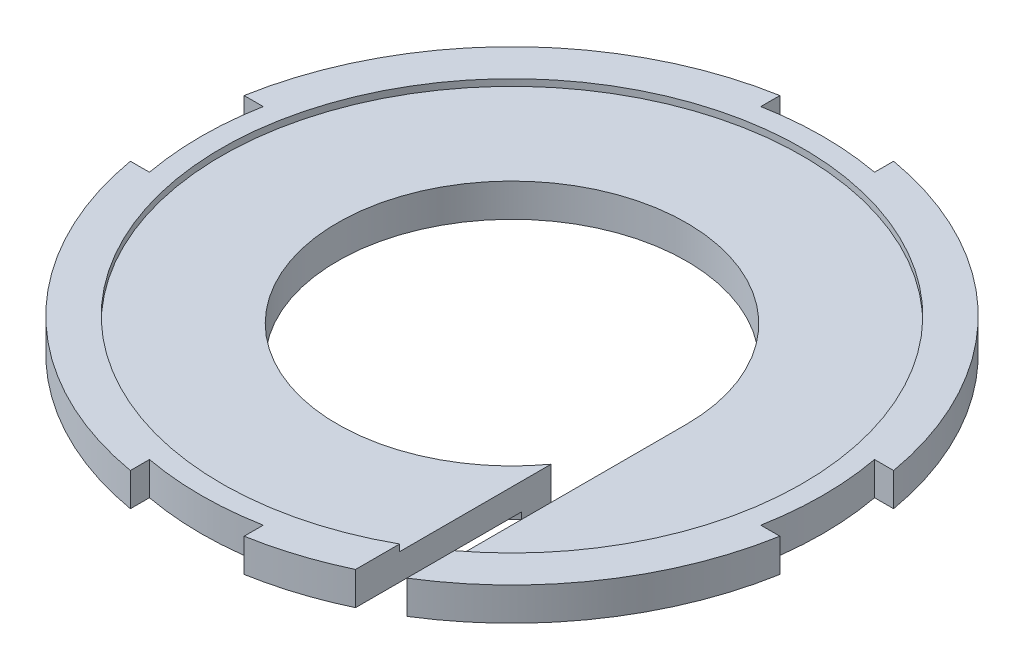
ISO-10303-21;
HEADER;
FILE_DESCRIPTION(('STEP AP214'),'2;1');
FILE_NAME('part.step','',(''),(''),'','','');
FILE_SCHEMA(('AUTOMOTIVE_DESIGN { 1 0 10303 214 1 1 1 1 }'));
ENDSEC;
DATA;
#1=APPLICATION_CONTEXT('core data for automotive mechanical design processes');
#2=APPLICATION_PROTOCOL_DEFINITION('international standard','automotive_design',2000,#1);
#3=PRODUCT_CONTEXT('',#1,'mechanical');
#4=PRODUCT('Part','Part','',(#3));
#5=PRODUCT_RELATED_PRODUCT_CATEGORY('part','',(#4));
#6=PRODUCT_DEFINITION_FORMATION('','',#4);
#7=PRODUCT_DEFINITION_CONTEXT('part definition',#1,'design');
#8=PRODUCT_DEFINITION('design','',#6,#7);
#9=PRODUCT_DEFINITION_SHAPE('','',#8);
#10=(LENGTH_UNIT() NAMED_UNIT(*) SI_UNIT(.MILLI.,.METRE.));
#11=(NAMED_UNIT(*) PLANE_ANGLE_UNIT() SI_UNIT($,.RADIAN.));
#12=(NAMED_UNIT(*) SI_UNIT($,.STERADIAN.) SOLID_ANGLE_UNIT());
#13=UNCERTAINTY_MEASURE_WITH_UNIT(LENGTH_MEASURE(1.E-05),#10,'distance_accuracy_value','');
#14=(GEOMETRIC_REPRESENTATION_CONTEXT(3) GLOBAL_UNCERTAINTY_ASSIGNED_CONTEXT((#13)) GLOBAL_UNIT_ASSIGNED_CONTEXT((#10,
#11,#12)) REPRESENTATION_CONTEXT('',''));
#15=CARTESIAN_POINT('',(0.,0.,0.));
#16=DIRECTION('',(0.,0.,1.));
#17=DIRECTION('',(1.,0.,0.));
#18=AXIS2_PLACEMENT_3D('',#15,#16,#17);
#19=CARTESIAN_POINT('',(20.066,0.,0.));
#20=DIRECTION('',(1.,0.,0.));
#21=DIRECTION('',(0.,0.,-1.));
#22=AXIS2_PLACEMENT_3D('',#19,#20,#21);
#23=PLANE('',#22);
#24=DIRECTION('',(0.,1.,0.));
#25=VECTOR('',#24,1.);
#26=CARTESIAN_POINT('',(20.0660000000001,3.048,26.7017311236556));
#27=LINE('',#26,#25);
#28=CARTESIAN_POINT('',(20.0660000000001,3.048,26.7017311236556));
#29=VERTEX_POINT('',#28);
#30=CARTESIAN_POINT('',(20.0660000000001,3.81,26.7017311236556));
#31=VERTEX_POINT('',#30);
#32=EDGE_CURVE('E237',#29,#31,#27,.T.);
#33=ORIENTED_EDGE('',*,*,#32,.F.);
#34=DIRECTION('',(0.,0.,-1.));
#35=VECTOR('',#34,1.);
#36=CARTESIAN_POINT('',(20.066,3.048,0.));
#37=LINE('',#36,#35);
#38=CARTESIAN_POINT('',(20.066,3.048,0.));
#39=VERTEX_POINT('',#38);
#40=EDGE_CURVE('E234',#29,#39,#37,.T.);
#41=ORIENTED_EDGE('',*,*,#40,.T.);
#42=DIRECTION('',(0.,1.,0.));
#43=VECTOR('',#42,1.);
#44=CARTESIAN_POINT('',(20.066,0.,0.));
#45=LINE('',#44,#43);
#46=CARTESIAN_POINT('',(20.066,-0.762,0.));
#47=VERTEX_POINT('',#46);
#48=EDGE_CURVE('E202',#47,#39,#45,.T.);
#49=ORIENTED_EDGE('',*,*,#48,.F.);
#50=DIRECTION('',(0.,0.,-1.));
#51=VECTOR('',#50,1.);
#52=CARTESIAN_POINT('',(20.066,-0.762,0.));
#53=LINE('',#52,#51);
#54=CARTESIAN_POINT('',(20.066,-0.762,9.55543138743609));
#55=VERTEX_POINT('',#54);
#56=EDGE_CURVE('E217',#55,#47,#53,.T.);
#57=ORIENTED_EDGE('',*,*,#56,.F.);
#58=DIRECTION('',(0.,1.,0.));
#59=VECTOR('',#58,1.);
#60=CARTESIAN_POINT('',(20.066,-0.762,9.55543138743609));
#61=LINE('',#60,#59);
#62=CARTESIAN_POINT('',(20.066,0.,9.55543138743609));
#63=VERTEX_POINT('',#62);
#64=EDGE_CURVE('E222',#55,#63,#61,.T.);
#65=ORIENTED_EDGE('',*,*,#64,.T.);
#66=DIRECTION('',(0.,0.,-1.));
#67=VECTOR('',#66,1.);
#68=CARTESIAN_POINT('',(20.066,0.,0.));
#69=LINE('',#68,#67);
#70=CARTESIAN_POINT('',(20.0660000000001,0.,32.1634238576989));
#71=VERTEX_POINT('',#70);
#72=EDGE_CURVE('E240',#71,#63,#69,.T.);
#73=ORIENTED_EDGE('',*,*,#72,.F.);
#74=DIRECTION('',(0.,1.,0.));
#75=VECTOR('',#74,1.);
#76=CARTESIAN_POINT('',(20.0660000000001,1.17154113246704E-13,32.1634238576989));
#77=LINE('',#76,#75);
#78=CARTESIAN_POINT('',(20.0660000000001,3.81,32.1634238576989));
#79=VERTEX_POINT('',#78);
#80=EDGE_CURVE('E251',#71,#79,#77,.T.);
#81=ORIENTED_EDGE('',*,*,#80,.T.);
#82=DIRECTION('',(0.,0.,-1.));
#83=VECTOR('',#82,1.);
#84=CARTESIAN_POINT('',(20.066,3.81,0.));
#85=LINE('',#84,#83);
#86=EDGE_CURVE('E239',#79,#31,#85,.T.);
#87=ORIENTED_EDGE('',*,*,#86,.T.);
#88=EDGE_LOOP('',(#33,#41,#49,#57,#65,#73,#81,#87));
#89=FACE_BOUND('',#88,.T.);
#90=ADVANCED_FACE('F33',(#89),#23,.F.);
#91=CARTESIAN_POINT('',(16.256,0.,0.));
#92=DIRECTION('',(-1.,0.,0.));
#93=DIRECTION('',(0.,0.,1.));
#94=AXIS2_PLACEMENT_3D('',#91,#92,#93);
#95=PLANE('',#94);
#96=DIRECTION('',(0.,1.,0.));
#97=VECTOR('',#96,1.);
#98=CARTESIAN_POINT('',(16.2560000000001,3.048,29.1782327257837));
#99=LINE('',#98,#97);
#100=CARTESIAN_POINT('',(16.2560000000001,3.81,29.1782327257837));
#101=VERTEX_POINT('',#100);
#102=CARTESIAN_POINT('',(16.2560000000001,3.048,29.1782327257837));
#103=VERTEX_POINT('',#102);
#104=EDGE_CURVE('E11',#101,#103,#99,.F.);
#105=ORIENTED_EDGE('',*,*,#104,.F.);
#106=DIRECTION('',(0.,0.,1.));
#107=VECTOR('',#106,1.);
#108=CARTESIAN_POINT('',(16.256,3.81,0.));
#109=LINE('',#108,#107);
#110=CARTESIAN_POINT('',(16.2560000000001,3.81,34.2472284170558));
#111=VERTEX_POINT('',#110);
#112=EDGE_CURVE('E243',#101,#111,#109,.T.);
#113=ORIENTED_EDGE('',*,*,#112,.T.);
#114=DIRECTION('',(0.,1.,0.));
#115=VECTOR('',#114,1.);
#116=CARTESIAN_POINT('',(16.2560000000001,1.24744296319595E-13,34.2472284170558));
#117=LINE('',#116,#115);
#118=CARTESIAN_POINT('',(16.2560000000001,0.,34.2472284170558));
#119=VERTEX_POINT('',#118);
#120=EDGE_CURVE('E201',#111,#119,#117,.F.);
#121=ORIENTED_EDGE('',*,*,#120,.T.);
#122=DIRECTION('',(0.,0.,1.));
#123=VECTOR('',#122,1.);
#124=CARTESIAN_POINT('',(16.256,0.,0.));
#125=LINE('',#124,#123);
#126=CARTESIAN_POINT('',(16.2560000000001,0.,15.1556289542862));
#127=VERTEX_POINT('',#126);
#128=EDGE_CURVE('E242',#127,#119,#125,.T.);
#129=ORIENTED_EDGE('',*,*,#128,.F.);
#130=DIRECTION('',(0.,1.,0.));
#131=VECTOR('',#130,1.);
#132=CARTESIAN_POINT('',(16.256,-0.762,15.1556289542862));
#133=LINE('',#132,#131);
#134=CARTESIAN_POINT('',(16.256,-0.762,15.1556289542862));
#135=VERTEX_POINT('',#134);
#136=EDGE_CURVE('E209',#135,#127,#133,.T.);
#137=ORIENTED_EDGE('',*,*,#136,.F.);
#138=DIRECTION('',(0.,0.,1.));
#139=VECTOR('',#138,1.);
#140=CARTESIAN_POINT('',(16.256,-0.762,11.7637927557399));
#141=LINE('',#140,#139);
#142=CARTESIAN_POINT('',(16.256,-0.762,11.7637927557399));
#143=VERTEX_POINT('',#142);
#144=EDGE_CURVE('E205',#143,#135,#141,.T.);
#145=ORIENTED_EDGE('',*,*,#144,.F.);
#146=DIRECTION('',(0.,1.,0.));
#147=VECTOR('',#146,1.);
#148=CARTESIAN_POINT('',(16.256,0.,11.7637927557399));
#149=LINE('',#148,#147);
#150=CARTESIAN_POINT('',(16.256,3.048,11.7637927557399));
#151=VERTEX_POINT('',#150);
#152=EDGE_CURVE('E194',#143,#151,#149,.T.);
#153=ORIENTED_EDGE('',*,*,#152,.T.);
#154=DIRECTION('',(0.,0.,1.));
#155=VECTOR('',#154,1.);
#156=CARTESIAN_POINT('',(16.256,3.048,0.));
#157=LINE('',#156,#155);
#158=EDGE_CURVE('E56',#151,#103,#157,.T.);
#159=ORIENTED_EDGE('',*,*,#158,.T.);
#160=EDGE_LOOP('',(#105,#113,#121,#129,#137,#145,#153,#159));
#161=FACE_BOUND('',#160,.T.);
#162=ADVANCED_FACE('F207',(#161),#95,.F.);
#163=CARTESIAN_POINT('',(0.,0.,0.));
#164=DIRECTION('',(0.,1.,0.));
#165=DIRECTION('',(0.,0.,1.));
#166=AXIS2_PLACEMENT_3D('',#163,#164,#165);
#167=CYLINDRICAL_SURFACE('',#166,37.9095);
#168=ORIENTED_EDGE('',*,*,#80,.F.);
#169=CARTESIAN_POINT('',(0.,0.,0.));
#170=DIRECTION('',(0.,1.,0.));
#171=DIRECTION('',(0.,0.,1.));
#172=AXIS2_PLACEMENT_3D('',#169,#170,#171);
#173=CIRCLE('',#172,37.9095);
#174=CARTESIAN_POINT('',(37.3410236870925,0.,6.5405));
#175=VERTEX_POINT('',#174);
#176=EDGE_CURVE('E328',#71,#175,#173,.T.);
#177=ORIENTED_EDGE('',*,*,#176,.T.);
#178=DIRECTION('',(0.,1.,0.));
#179=VECTOR('',#178,1.);
#180=CARTESIAN_POINT('',(37.3410236870925,0.,6.5405));
#181=LINE('',#180,#179);
#182=CARTESIAN_POINT('',(37.3410236870925,3.81,6.54049999999998));
#183=VERTEX_POINT('',#182);
#184=EDGE_CURVE('E333',#175,#183,#181,.T.);
#185=ORIENTED_EDGE('',*,*,#184,.T.);
#186=CARTESIAN_POINT('',(0.,3.81,0.));
#187=DIRECTION('',(0.,1.,0.));
#188=DIRECTION('',(0.,0.,1.));
#189=AXIS2_PLACEMENT_3D('',#186,#187,#188);
#190=CIRCLE('',#189,37.9095);
#191=EDGE_CURVE('E288',#79,#183,#190,.T.);
#192=ORIENTED_EDGE('',*,*,#191,.F.);
#193=EDGE_LOOP('',(#168,#177,#185,#192));
#194=FACE_BOUND('',#193,.T.);
#195=ADVANCED_FACE('F387',(#194),#167,.T.);
#196=CARTESIAN_POINT('',(0.,0.,0.));
#197=DIRECTION('',(0.,1.,0.));
#198=DIRECTION('',(0.,0.,1.));
#199=AXIS2_PLACEMENT_3D('',#196,#197,#198);
#200=CYLINDRICAL_SURFACE('',#199,35.7505);
#201=DIRECTION('',(0.,1.,0.));
#202=VECTOR('',#201,1.);
#203=CARTESIAN_POINT('',(35.1471209347224,0.,-6.5405));
#204=LINE('',#203,#202);
#205=CARTESIAN_POINT('',(35.1471209347224,0.,-6.5405));
#206=VERTEX_POINT('',#205);
#207=CARTESIAN_POINT('',(35.1471209347224,3.81,-6.54050000000001));
#208=VERTEX_POINT('',#207);
#209=EDGE_CURVE('E338',#206,#208,#204,.T.);
#210=ORIENTED_EDGE('',*,*,#209,.T.);
#211=CARTESIAN_POINT('',(0.,3.81,0.));
#212=DIRECTION('',(0.,1.,0.));
#213=DIRECTION('',(0.,0.,1.));
#214=AXIS2_PLACEMENT_3D('',#211,#212,#213);
#215=CIRCLE('',#214,35.7505);
#216=CARTESIAN_POINT('',(35.1471209347224,3.81,6.54049999999999));
#217=VERTEX_POINT('',#216);
#218=EDGE_CURVE('E258',#217,#208,#215,.T.);
#219=ORIENTED_EDGE('',*,*,#218,.F.);
#220=DIRECTION('',(0.,1.,0.));
#221=VECTOR('',#220,1.);
#222=CARTESIAN_POINT('',(35.1471209347224,0.,6.5405));
#223=LINE('',#222,#221);
#224=CARTESIAN_POINT('',(35.1471209347224,0.,6.5405));
#225=VERTEX_POINT('',#224);
#226=EDGE_CURVE('E253',#225,#217,#223,.T.);
#227=ORIENTED_EDGE('',*,*,#226,.F.);
#228=CARTESIAN_POINT('',(0.,0.,0.));
#229=DIRECTION('',(0.,1.,0.));
#230=DIRECTION('',(0.,0.,1.));
#231=AXIS2_PLACEMENT_3D('',#228,#229,#230);
#232=CIRCLE('',#231,35.7505);
#233=EDGE_CURVE('E307',#225,#206,#232,.T.);
#234=ORIENTED_EDGE('',*,*,#233,.T.);
#235=EDGE_LOOP('',(#210,#219,#227,#234));
#236=FACE_BOUND('',#235,.T.);
#237=ADVANCED_FACE('F399',(#236),#200,.T.);
#238=CARTESIAN_POINT('',(35.1471209347224,0.,-6.5405));
#239=DIRECTION('',(0.,0.,1.));
#240=DIRECTION('',(0.,-1.,0.));
#241=AXIS2_PLACEMENT_3D('',#238,#239,#240);
#242=PLANE('',#241);
#243=DIRECTION('',(0.,1.,0.));
#244=VECTOR('',#243,1.);
#245=CARTESIAN_POINT('',(37.3410236870925,0.,-6.5405));
#246=LINE('',#245,#244);
#247=CARTESIAN_POINT('',(37.3410236870925,0.,-6.5405));
#248=VERTEX_POINT('',#247);
#249=CARTESIAN_POINT('',(37.3410236870925,3.81,-6.54050000000001));
#250=VERTEX_POINT('',#249);
#251=EDGE_CURVE('E341',#248,#250,#246,.T.);
#252=ORIENTED_EDGE('',*,*,#251,.T.);
#253=DIRECTION('',(1.,0.,0.));
#254=VECTOR('',#253,1.);
#255=CARTESIAN_POINT('',(35.1471209347224,3.81,-6.54050000000001));
#256=LINE('',#255,#254);
#257=EDGE_CURVE('E254',#208,#250,#256,.T.);
#258=ORIENTED_EDGE('',*,*,#257,.F.);
#259=ORIENTED_EDGE('',*,*,#209,.F.);
#260=DIRECTION('',(1.,0.,0.));
#261=VECTOR('',#260,1.);
#262=CARTESIAN_POINT('',(35.1471209347224,0.,-6.5405));
#263=LINE('',#262,#261);
#264=EDGE_CURVE('E304',#206,#248,#263,.T.);
#265=ORIENTED_EDGE('',*,*,#264,.T.);
#266=EDGE_LOOP('',(#252,#258,#259,#265));
#267=FACE_BOUND('',#266,.T.);
#268=ADVANCED_FACE('F401',(#267),#242,.T.);
#269=CARTESIAN_POINT('',(0.,0.,0.));
#270=DIRECTION('',(0.,1.,0.));
#271=DIRECTION('',(0.,0.,1.));
#272=AXIS2_PLACEMENT_3D('',#269,#270,#271);
#273=CYLINDRICAL_SURFACE('',#272,37.9095);
#274=DIRECTION('',(0.,1.,0.));
#275=VECTOR('',#274,1.);
#276=CARTESIAN_POINT('',(6.5405,0.,-37.3410236870925));
#277=LINE('',#276,#275);
#278=CARTESIAN_POINT('',(6.5405,0.,-37.3410236870925));
#279=VERTEX_POINT('',#278);
#280=CARTESIAN_POINT('',(6.5405,3.81,-37.3410236870925));
#281=VERTEX_POINT('',#280);
#282=EDGE_CURVE('E346',#279,#281,#277,.T.);
#283=ORIENTED_EDGE('',*,*,#282,.T.);
#284=CARTESIAN_POINT('',(0.,3.81,0.));
#285=DIRECTION('',(0.,1.,0.));
#286=DIRECTION('',(0.,0.,1.));
#287=AXIS2_PLACEMENT_3D('',#284,#285,#286);
#288=CIRCLE('',#287,37.9095);
#289=EDGE_CURVE('E257',#250,#281,#288,.T.);
#290=ORIENTED_EDGE('',*,*,#289,.F.);
#291=ORIENTED_EDGE('',*,*,#251,.F.);
#292=CARTESIAN_POINT('',(0.,0.,0.));
#293=DIRECTION('',(0.,1.,0.));
#294=DIRECTION('',(0.,0.,1.));
#295=AXIS2_PLACEMENT_3D('',#292,#293,#294);
#296=CIRCLE('',#295,37.9095);
#297=EDGE_CURVE('E306',#248,#279,#296,.T.);
#298=ORIENTED_EDGE('',*,*,#297,.T.);
#299=EDGE_LOOP('',(#283,#290,#291,#298));
#300=FACE_BOUND('',#299,.T.);
#301=ADVANCED_FACE('F465',(#300),#273,.T.);
#302=CARTESIAN_POINT('',(6.54049999999999,0.,-35.1471209347224));
#303=DIRECTION('',(-1.,0.,0.));
#304=DIRECTION('',(0.,0.,1.));
#305=AXIS2_PLACEMENT_3D('',#302,#303,#304);
#306=PLANE('',#305);
#307=DIRECTION('',(0.,1.,0.));
#308=VECTOR('',#307,1.);
#309=CARTESIAN_POINT('',(6.54049999999999,0.,-35.1471209347224));
#310=LINE('',#309,#308);
#311=CARTESIAN_POINT('',(6.54049999999999,0.,-35.1471209347224));
#312=VERTEX_POINT('',#311);
#313=CARTESIAN_POINT('',(6.54049999999999,3.81,-35.1471209347224));
#314=VERTEX_POINT('',#313);
#315=EDGE_CURVE('E349',#312,#314,#310,.T.);
#316=ORIENTED_EDGE('',*,*,#315,.T.);
#317=DIRECTION('',(0.,0.,1.));
#318=VECTOR('',#317,1.);
#319=CARTESIAN_POINT('',(6.54049999999999,3.81,-35.1471209347224));
#320=LINE('',#319,#318);
#321=EDGE_CURVE('E261',#281,#314,#320,.T.);
#322=ORIENTED_EDGE('',*,*,#321,.F.);
#323=ORIENTED_EDGE('',*,*,#282,.F.);
#324=DIRECTION('',(0.,0.,1.));
#325=VECTOR('',#324,1.);
#326=CARTESIAN_POINT('',(6.54049999999999,0.,-35.1471209347224));
#327=LINE('',#326,#325);
#328=EDGE_CURVE('E309',#279,#312,#327,.T.);
#329=ORIENTED_EDGE('',*,*,#328,.T.);
#330=EDGE_LOOP('',(#316,#322,#323,#329));
#331=FACE_BOUND('',#330,.T.);
#332=ADVANCED_FACE('F462',(#331),#306,.T.);
#333=CARTESIAN_POINT('',(0.,0.,0.));
#334=DIRECTION('',(0.,1.,0.));
#335=DIRECTION('',(0.,0.,1.));
#336=AXIS2_PLACEMENT_3D('',#333,#334,#335);
#337=CYLINDRICAL_SURFACE('',#336,35.7505);
#338=DIRECTION('',(0.,1.,0.));
#339=VECTOR('',#338,1.);
#340=CARTESIAN_POINT('',(-6.5405,0.,-35.1471209347224));
#341=LINE('',#340,#339);
#342=CARTESIAN_POINT('',(-6.5405,0.,-35.1471209347224));
#343=VERTEX_POINT('',#342);
#344=CARTESIAN_POINT('',(-6.5405,3.81,-35.1471209347224));
#345=VERTEX_POINT('',#344);
#346=EDGE_CURVE('E352',#343,#345,#341,.T.);
#347=ORIENTED_EDGE('',*,*,#346,.T.);
#348=CARTESIAN_POINT('',(0.,3.81,0.));
#349=DIRECTION('',(0.,1.,0.));
#350=DIRECTION('',(0.,0.,1.));
#351=AXIS2_PLACEMENT_3D('',#348,#349,#350);
#352=CIRCLE('',#351,35.7505);
#353=EDGE_CURVE('E262',#314,#345,#352,.T.);
#354=ORIENTED_EDGE('',*,*,#353,.F.);
#355=ORIENTED_EDGE('',*,*,#315,.F.);
#356=CARTESIAN_POINT('',(0.,0.,0.));
#357=DIRECTION('',(0.,1.,0.));
#358=DIRECTION('',(0.,0.,1.));
#359=AXIS2_PLACEMENT_3D('',#356,#357,#358);
#360=CIRCLE('',#359,35.7505);
#361=EDGE_CURVE('E310',#312,#343,#360,.T.);
#362=ORIENTED_EDGE('',*,*,#361,.T.);
#363=EDGE_LOOP('',(#347,#354,#355,#362));
#364=FACE_BOUND('',#363,.T.);
#365=ADVANCED_FACE('F460',(#364),#337,.T.);
#366=CARTESIAN_POINT('',(-6.54050000000001,0.,-35.1471209347224));
#367=DIRECTION('',(1.,0.,0.));
#368=DIRECTION('',(0.,0.,-1.));
#369=AXIS2_PLACEMENT_3D('',#366,#367,#368);
#370=PLANE('',#369);
#371=DIRECTION('',(0.,1.,0.));
#372=VECTOR('',#371,1.);
#373=CARTESIAN_POINT('',(-6.54050000000001,0.,-37.3410236870925));
#374=LINE('',#373,#372);
#375=CARTESIAN_POINT('',(-6.54050000000001,0.,-37.3410236870925));
#376=VERTEX_POINT('',#375);
#377=CARTESIAN_POINT('',(-6.54050000000001,3.81,-37.3410236870925));
#378=VERTEX_POINT('',#377);
#379=EDGE_CURVE('E355',#376,#378,#374,.T.);
#380=ORIENTED_EDGE('',*,*,#379,.T.);
#381=DIRECTION('',(0.,0.,-1.));
#382=VECTOR('',#381,1.);
#383=CARTESIAN_POINT('',(-6.54050000000001,3.81,-35.1471209347224));
#384=LINE('',#383,#382);
#385=EDGE_CURVE('E265',#345,#378,#384,.T.);
#386=ORIENTED_EDGE('',*,*,#385,.F.);
#387=ORIENTED_EDGE('',*,*,#346,.F.);
#388=DIRECTION('',(0.,0.,-1.));
#389=VECTOR('',#388,1.);
#390=CARTESIAN_POINT('',(-6.54050000000001,0.,-35.1471209347224));
#391=LINE('',#390,#389);
#392=EDGE_CURVE('E312',#343,#376,#391,.T.);
#393=ORIENTED_EDGE('',*,*,#392,.T.);
#394=EDGE_LOOP('',(#380,#386,#387,#393));
#395=FACE_BOUND('',#394,.T.);
#396=ADVANCED_FACE('F453',(#395),#370,.T.);
#397=CARTESIAN_POINT('',(0.,0.,0.));
#398=DIRECTION('',(0.,1.,0.));
#399=DIRECTION('',(0.,0.,1.));
#400=AXIS2_PLACEMENT_3D('',#397,#398,#399);
#401=CYLINDRICAL_SURFACE('',#400,37.9095);
#402=DIRECTION('',(0.,1.,0.));
#403=VECTOR('',#402,1.);
#404=CARTESIAN_POINT('',(-37.3410236870925,0.,-6.54049999999999));
#405=LINE('',#404,#403);
#406=CARTESIAN_POINT('',(-37.3410236870925,0.,-6.54049999999999));
#407=VERTEX_POINT('',#406);
#408=CARTESIAN_POINT('',(-37.3410236870925,3.81,-6.5405));
#409=VERTEX_POINT('',#408);
#410=EDGE_CURVE('E358',#407,#409,#405,.T.);
#411=ORIENTED_EDGE('',*,*,#410,.T.);
#412=CARTESIAN_POINT('',(0.,3.81,0.));
#413=DIRECTION('',(0.,1.,0.));
#414=DIRECTION('',(0.,0.,1.));
#415=AXIS2_PLACEMENT_3D('',#412,#413,#414);
#416=CIRCLE('',#415,37.9095);
#417=EDGE_CURVE('E268',#378,#409,#416,.T.);
#418=ORIENTED_EDGE('',*,*,#417,.F.);
#419=ORIENTED_EDGE('',*,*,#379,.F.);
#420=CARTESIAN_POINT('',(0.,0.,0.));
#421=DIRECTION('',(0.,1.,0.));
#422=DIRECTION('',(0.,0.,1.));
#423=AXIS2_PLACEMENT_3D('',#420,#421,#422);
#424=CIRCLE('',#423,37.9095);
#425=EDGE_CURVE('E314',#376,#407,#424,.T.);
#426=ORIENTED_EDGE('',*,*,#425,.T.);
#427=EDGE_LOOP('',(#411,#418,#419,#426));
#428=FACE_BOUND('',#427,.T.);
#429=ADVANCED_FACE('F451',(#428),#401,.T.);
#430=CARTESIAN_POINT('',(-35.1471209347224,0.,-6.54049999999999));
#431=DIRECTION('',(0.,0.,1.));
#432=DIRECTION('',(0.,-1.,0.));
#433=AXIS2_PLACEMENT_3D('',#430,#431,#432);
#434=PLANE('',#433);
#435=DIRECTION('',(0.,1.,0.));
#436=VECTOR('',#435,1.);
#437=CARTESIAN_POINT('',(-35.1471209347224,0.,-6.54049999999999));
#438=LINE('',#437,#436);
#439=CARTESIAN_POINT('',(-35.1471209347224,0.,-6.54049999999999));
#440=VERTEX_POINT('',#439);
#441=CARTESIAN_POINT('',(-35.1471209347224,3.81,-6.54050000000001));
#442=VERTEX_POINT('',#441);
#443=EDGE_CURVE('E361',#440,#442,#438,.T.);
#444=ORIENTED_EDGE('',*,*,#443,.T.);
#445=DIRECTION('',(1.,0.,0.));
#446=VECTOR('',#445,1.);
#447=CARTESIAN_POINT('',(-35.1471209347224,3.81,-6.54050000000001));
#448=LINE('',#447,#446);
#449=EDGE_CURVE('E271',#409,#442,#448,.T.);
#450=ORIENTED_EDGE('',*,*,#449,.F.);
#451=ORIENTED_EDGE('',*,*,#410,.F.);
#452=DIRECTION('',(1.,0.,0.));
#453=VECTOR('',#452,1.);
#454=CARTESIAN_POINT('',(-35.1471209347224,0.,-6.54049999999999));
#455=LINE('',#454,#453);
#456=EDGE_CURVE('E316',#407,#440,#455,.T.);
#457=ORIENTED_EDGE('',*,*,#456,.T.);
#458=EDGE_LOOP('',(#444,#450,#451,#457));
#459=FACE_BOUND('',#458,.T.);
#460=ADVANCED_FACE('F447',(#459),#434,.T.);
#461=CARTESIAN_POINT('',(0.,0.,0.));
#462=DIRECTION('',(0.,1.,0.));
#463=DIRECTION('',(0.,0.,1.));
#464=AXIS2_PLACEMENT_3D('',#461,#462,#463);
#465=CYLINDRICAL_SURFACE('',#464,35.7505);
#466=DIRECTION('',(0.,1.,0.));
#467=VECTOR('',#466,1.);
#468=CARTESIAN_POINT('',(-35.1471209347224,0.,6.54049999999998));
#469=LINE('',#468,#467);
#470=CARTESIAN_POINT('',(-35.1471209347224,0.,6.54049999999998));
#471=VERTEX_POINT('',#470);
#472=CARTESIAN_POINT('',(-35.1471209347224,3.81,6.54049999999997));
#473=VERTEX_POINT('',#472);
#474=EDGE_CURVE('E364',#471,#473,#469,.T.);
#475=ORIENTED_EDGE('',*,*,#474,.T.);
#476=CARTESIAN_POINT('',(0.,3.81,0.));
#477=DIRECTION('',(0.,1.,0.));
#478=DIRECTION('',(0.,0.,1.));
#479=AXIS2_PLACEMENT_3D('',#476,#477,#478);
#480=CIRCLE('',#479,35.7505);
#481=EDGE_CURVE('E272',#442,#473,#480,.T.);
#482=ORIENTED_EDGE('',*,*,#481,.F.);
#483=ORIENTED_EDGE('',*,*,#443,.F.);
#484=CARTESIAN_POINT('',(0.,0.,0.));
#485=DIRECTION('',(0.,1.,0.));
#486=DIRECTION('',(0.,0.,1.));
#487=AXIS2_PLACEMENT_3D('',#484,#485,#486);
#488=CIRCLE('',#487,35.7505);
#489=EDGE_CURVE('E317',#440,#471,#488,.T.);
#490=ORIENTED_EDGE('',*,*,#489,.T.);
#491=EDGE_LOOP('',(#475,#482,#483,#490));
#492=FACE_BOUND('',#491,.T.);
#493=ADVANCED_FACE('F445',(#492),#465,.T.);
#494=CARTESIAN_POINT('',(-35.1471209347224,0.,6.54050000000001));
#495=DIRECTION('',(0.,0.,-1.));
#496=DIRECTION('',(0.,1.,0.));
#497=AXIS2_PLACEMENT_3D('',#494,#495,#496);
#498=PLANE('',#497);
#499=DIRECTION('',(0.,1.,0.));
#500=VECTOR('',#499,1.);
#501=CARTESIAN_POINT('',(-37.3410236870925,0.,6.54050000000001));
#502=LINE('',#501,#500);
#503=CARTESIAN_POINT('',(-37.3410236870925,0.,6.54050000000001));
#504=VERTEX_POINT('',#503);
#505=CARTESIAN_POINT('',(-37.3410236870925,3.81,6.54049999999999));
#506=VERTEX_POINT('',#505);
#507=EDGE_CURVE('E367',#504,#506,#502,.T.);
#508=ORIENTED_EDGE('',*,*,#507,.T.);
#509=DIRECTION('',(-1.,0.,0.));
#510=VECTOR('',#509,1.);
#511=CARTESIAN_POINT('',(-35.1471209347224,3.81,6.54049999999999));
#512=LINE('',#511,#510);
#513=EDGE_CURVE('E275',#473,#506,#512,.T.);
#514=ORIENTED_EDGE('',*,*,#513,.F.);
#515=ORIENTED_EDGE('',*,*,#474,.F.);
#516=DIRECTION('',(-1.,0.,0.));
#517=VECTOR('',#516,1.);
#518=CARTESIAN_POINT('',(-35.1471209347224,0.,6.54050000000001));
#519=LINE('',#518,#517);
#520=EDGE_CURVE('E319',#471,#504,#519,.T.);
#521=ORIENTED_EDGE('',*,*,#520,.T.);
#522=EDGE_LOOP('',(#508,#514,#515,#521));
#523=FACE_BOUND('',#522,.T.);
#524=ADVANCED_FACE('F437',(#523),#498,.T.);
#525=CARTESIAN_POINT('',(0.,0.,0.));
#526=DIRECTION('',(0.,1.,0.));
#527=DIRECTION('',(0.,0.,1.));
#528=AXIS2_PLACEMENT_3D('',#525,#526,#527);
#529=CYLINDRICAL_SURFACE('',#528,37.9095);
#530=DIRECTION('',(0.,1.,0.));
#531=VECTOR('',#530,1.);
#532=CARTESIAN_POINT('',(-6.54050000000002,0.,37.3410236870925));
#533=LINE('',#532,#531);
#534=CARTESIAN_POINT('',(-6.54050000000002,0.,37.3410236870925));
#535=VERTEX_POINT('',#534);
#536=CARTESIAN_POINT('',(-6.54050000000002,3.81,37.3410236870924));
#537=VERTEX_POINT('',#536);
#538=EDGE_CURVE('E370',#535,#537,#533,.T.);
#539=ORIENTED_EDGE('',*,*,#538,.T.);
#540=CARTESIAN_POINT('',(0.,3.81,0.));
#541=DIRECTION('',(0.,1.,0.));
#542=DIRECTION('',(0.,0.,1.));
#543=AXIS2_PLACEMENT_3D('',#540,#541,#542);
#544=CIRCLE('',#543,37.9095);
#545=EDGE_CURVE('E278',#506,#537,#544,.T.);
#546=ORIENTED_EDGE('',*,*,#545,.F.);
#547=ORIENTED_EDGE('',*,*,#507,.F.);
#548=CARTESIAN_POINT('',(0.,0.,0.));
#549=DIRECTION('',(0.,1.,0.));
#550=DIRECTION('',(0.,0.,1.));
#551=AXIS2_PLACEMENT_3D('',#548,#549,#550);
#552=CIRCLE('',#551,37.9095);
#553=EDGE_CURVE('E321',#504,#535,#552,.T.);
#554=ORIENTED_EDGE('',*,*,#553,.T.);
#555=EDGE_LOOP('',(#539,#546,#547,#554));
#556=FACE_BOUND('',#555,.T.);
#557=ADVANCED_FACE('F435',(#556),#529,.T.);
#558=CARTESIAN_POINT('',(-6.5405,0.,35.1471209347224));
#559=DIRECTION('',(1.,0.,0.));
#560=DIRECTION('',(0.,0.,-1.));
#561=AXIS2_PLACEMENT_3D('',#558,#559,#560);
#562=PLANE('',#561);
#563=DIRECTION('',(0.,1.,0.));
#564=VECTOR('',#563,1.);
#565=CARTESIAN_POINT('',(-6.5405,0.,35.1471209347224));
#566=LINE('',#565,#564);
#567=CARTESIAN_POINT('',(-6.5405,0.,35.1471209347224));
#568=VERTEX_POINT('',#567);
#569=CARTESIAN_POINT('',(-6.5405,3.81,35.1471209347224));
#570=VERTEX_POINT('',#569);
#571=EDGE_CURVE('E373',#568,#570,#566,.T.);
#572=ORIENTED_EDGE('',*,*,#571,.T.);
#573=DIRECTION('',(0.,0.,-1.));
#574=VECTOR('',#573,1.);
#575=CARTESIAN_POINT('',(-6.5405,3.81,35.1471209347224));
#576=LINE('',#575,#574);
#577=EDGE_CURVE('E281',#537,#570,#576,.T.);
#578=ORIENTED_EDGE('',*,*,#577,.F.);
#579=ORIENTED_EDGE('',*,*,#538,.F.);
#580=DIRECTION('',(0.,0.,-1.));
#581=VECTOR('',#580,1.);
#582=CARTESIAN_POINT('',(-6.5405,0.,35.1471209347224));
#583=LINE('',#582,#581);
#584=EDGE_CURVE('E323',#535,#568,#583,.T.);
#585=ORIENTED_EDGE('',*,*,#584,.T.);
#586=EDGE_LOOP('',(#572,#578,#579,#585));
#587=FACE_BOUND('',#586,.T.);
#588=ADVANCED_FACE('F431',(#587),#562,.T.);
#589=CARTESIAN_POINT('',(0.,0.,0.));
#590=DIRECTION('',(0.,1.,0.));
#591=DIRECTION('',(0.,0.,1.));
#592=AXIS2_PLACEMENT_3D('',#589,#590,#591);
#593=CYLINDRICAL_SURFACE('',#592,35.7505);
#594=DIRECTION('',(0.,1.,0.));
#595=VECTOR('',#594,1.);
#596=CARTESIAN_POINT('',(6.54049999999999,0.,35.1471209347224));
#597=LINE('',#596,#595);
#598=CARTESIAN_POINT('',(6.54049999999999,0.,35.1471209347224));
#599=VERTEX_POINT('',#598);
#600=CARTESIAN_POINT('',(6.54049999999999,3.81,35.1471209347224));
#601=VERTEX_POINT('',#600);
#602=EDGE_CURVE('E376',#599,#601,#597,.T.);
#603=ORIENTED_EDGE('',*,*,#602,.T.);
#604=CARTESIAN_POINT('',(0.,3.81,0.));
#605=DIRECTION('',(0.,1.,0.));
#606=DIRECTION('',(0.,0.,1.));
#607=AXIS2_PLACEMENT_3D('',#604,#605,#606);
#608=CIRCLE('',#607,35.7505);
#609=EDGE_CURVE('E282',#570,#601,#608,.T.);
#610=ORIENTED_EDGE('',*,*,#609,.F.);
#611=ORIENTED_EDGE('',*,*,#571,.F.);
#612=CARTESIAN_POINT('',(0.,0.,0.));
#613=DIRECTION('',(0.,1.,0.));
#614=DIRECTION('',(0.,0.,1.));
#615=AXIS2_PLACEMENT_3D('',#612,#613,#614);
#616=CIRCLE('',#615,35.7505);
#617=EDGE_CURVE('E324',#568,#599,#616,.T.);
#618=ORIENTED_EDGE('',*,*,#617,.T.);
#619=EDGE_LOOP('',(#603,#610,#611,#618));
#620=FACE_BOUND('',#619,.T.);
#621=ADVANCED_FACE('F429',(#620),#593,.T.);
#622=CARTESIAN_POINT('',(6.5405,0.,35.1471209347224));
#623=DIRECTION('',(-1.,0.,0.));
#624=DIRECTION('',(0.,0.,1.));
#625=AXIS2_PLACEMENT_3D('',#622,#623,#624);
#626=PLANE('',#625);
#627=DIRECTION('',(0.,1.,0.));
#628=VECTOR('',#627,1.);
#629=CARTESIAN_POINT('',(6.5405,0.,37.3410236870925));
#630=LINE('',#629,#628);
#631=CARTESIAN_POINT('',(6.5405,0.,37.3410236870925));
#632=VERTEX_POINT('',#631);
#633=CARTESIAN_POINT('',(6.5405,3.81,37.3410236870924));
#634=VERTEX_POINT('',#633);
#635=EDGE_CURVE('E379',#632,#634,#630,.T.);
#636=ORIENTED_EDGE('',*,*,#635,.T.);
#637=DIRECTION('',(0.,0.,1.));
#638=VECTOR('',#637,1.);
#639=CARTESIAN_POINT('',(6.5405,3.81,35.1471209347224));
#640=LINE('',#639,#638);
#641=EDGE_CURVE('E285',#601,#634,#640,.T.);
#642=ORIENTED_EDGE('',*,*,#641,.F.);
#643=ORIENTED_EDGE('',*,*,#602,.F.);
#644=DIRECTION('',(0.,0.,1.));
#645=VECTOR('',#644,1.);
#646=CARTESIAN_POINT('',(6.5405,0.,35.1471209347224));
#647=LINE('',#646,#645);
#648=EDGE_CURVE('E326',#599,#632,#647,.T.);
#649=ORIENTED_EDGE('',*,*,#648,.T.);
#650=EDGE_LOOP('',(#636,#642,#643,#649));
#651=FACE_BOUND('',#650,.T.);
#652=ADVANCED_FACE('F421',(#651),#626,.T.);
#653=ORIENTED_EDGE('',*,*,#120,.F.);
#654=EDGE_CURVE('E289',#634,#111,#190,.T.);
#655=ORIENTED_EDGE('',*,*,#654,.F.);
#656=ORIENTED_EDGE('',*,*,#635,.F.);
#657=EDGE_CURVE('E329',#632,#119,#173,.T.);
#658=ORIENTED_EDGE('',*,*,#657,.T.);
#659=EDGE_LOOP('',(#653,#655,#656,#658));
#660=FACE_BOUND('',#659,.T.);
#661=ADVANCED_FACE('F418',(#660),#167,.T.);
#662=CARTESIAN_POINT('',(35.1471209347224,0.,6.5405));
#663=DIRECTION('',(0.,0.,-1.));
#664=DIRECTION('',(0.,1.,0.));
#665=AXIS2_PLACEMENT_3D('',#662,#663,#664);
#666=PLANE('',#665);
#667=DIRECTION('',(-1.,0.,0.));
#668=VECTOR('',#667,1.);
#669=CARTESIAN_POINT('',(35.1471209347224,3.81,6.54049999999999));
#670=LINE('',#669,#668);
#671=EDGE_CURVE('E292',#183,#217,#670,.T.);
#672=ORIENTED_EDGE('',*,*,#671,.F.);
#673=ORIENTED_EDGE('',*,*,#184,.F.);
#674=DIRECTION('',(-1.,0.,0.));
#675=VECTOR('',#674,1.);
#676=CARTESIAN_POINT('',(35.1471209347224,0.,6.5405));
#677=LINE('',#676,#675);
#678=EDGE_CURVE('E295',#175,#225,#677,.T.);
#679=ORIENTED_EDGE('',*,*,#678,.T.);
#680=ORIENTED_EDGE('',*,*,#226,.T.);
#681=EDGE_LOOP('',(#672,#673,#679,#680));
#682=FACE_BOUND('',#681,.T.);
#683=ADVANCED_FACE('F35',(#682),#666,.T.);
#684=CARTESIAN_POINT('',(0.,0.,0.));
#685=DIRECTION('',(0.,1.,0.));
#686=DIRECTION('',(0.,0.,1.));
#687=AXIS2_PLACEMENT_3D('',#684,#685,#686);
#688=PLANE('',#687);
#689=CARTESIAN_POINT('',(0.,0.,0.));
#690=DIRECTION('',(0.,-1.,0.));
#691=DIRECTION('',(0.,0.,-1.));
#692=AXIS2_PLACEMENT_3D('',#689,#690,#691);
#693=CIRCLE('',#692,22.225);
#694=EDGE_CURVE('E48',#127,#63,#693,.T.);
#695=ORIENTED_EDGE('',*,*,#694,.F.);
#696=ORIENTED_EDGE('',*,*,#128,.T.);
#697=ORIENTED_EDGE('',*,*,#657,.F.);
#698=ORIENTED_EDGE('',*,*,#648,.F.);
#699=ORIENTED_EDGE('',*,*,#617,.F.);
#700=ORIENTED_EDGE('',*,*,#584,.F.);
#701=ORIENTED_EDGE('',*,*,#553,.F.);
#702=ORIENTED_EDGE('',*,*,#520,.F.);
#703=ORIENTED_EDGE('',*,*,#489,.F.);
#704=ORIENTED_EDGE('',*,*,#456,.F.);
#705=ORIENTED_EDGE('',*,*,#425,.F.);
#706=ORIENTED_EDGE('',*,*,#392,.F.);
#707=ORIENTED_EDGE('',*,*,#361,.F.);
#708=ORIENTED_EDGE('',*,*,#328,.F.);
#709=ORIENTED_EDGE('',*,*,#297,.F.);
#710=ORIENTED_EDGE('',*,*,#264,.F.);
#711=ORIENTED_EDGE('',*,*,#233,.F.);
#712=ORIENTED_EDGE('',*,*,#678,.F.);
#713=ORIENTED_EDGE('',*,*,#176,.F.);
#714=ORIENTED_EDGE('',*,*,#72,.T.);
#715=EDGE_LOOP('',(#695,#696,#697,#698,#699,#700,#701,#702,#703,#704,#705,#706,#707,#708,#709,
#710,#711,#712,#713,#714));
#716=FACE_BOUND('',#715,.T.);
#717=ADVANCED_FACE('F394',(#716),#688,.F.);
#718=CARTESIAN_POINT('',(0.,3.81,0.));
#719=DIRECTION('',(0.,1.,0.));
#720=DIRECTION('',(0.,0.,1.));
#721=AXIS2_PLACEMENT_3D('',#718,#719,#720);
#722=PLANE('',#721);
#723=ORIENTED_EDGE('',*,*,#112,.F.);
#724=CARTESIAN_POINT('',(0.,3.81,0.));
#725=DIRECTION('',(0.,-1.,0.));
#726=DIRECTION('',(0.,0.,-1.));
#727=AXIS2_PLACEMENT_3D('',#724,#725,#726);
#728=CIRCLE('',#727,33.401);
#729=EDGE_CURVE('E227',#101,#31,#728,.T.);
#730=ORIENTED_EDGE('',*,*,#729,.T.);
#731=ORIENTED_EDGE('',*,*,#86,.F.);
#732=ORIENTED_EDGE('',*,*,#191,.T.);
#733=ORIENTED_EDGE('',*,*,#671,.T.);
#734=ORIENTED_EDGE('',*,*,#218,.T.);
#735=ORIENTED_EDGE('',*,*,#257,.T.);
#736=ORIENTED_EDGE('',*,*,#289,.T.);
#737=ORIENTED_EDGE('',*,*,#321,.T.);
#738=ORIENTED_EDGE('',*,*,#353,.T.);
#739=ORIENTED_EDGE('',*,*,#385,.T.);
#740=ORIENTED_EDGE('',*,*,#417,.T.);
#741=ORIENTED_EDGE('',*,*,#449,.T.);
#742=ORIENTED_EDGE('',*,*,#481,.T.);
#743=ORIENTED_EDGE('',*,*,#513,.T.);
#744=ORIENTED_EDGE('',*,*,#545,.T.);
#745=ORIENTED_EDGE('',*,*,#577,.T.);
#746=ORIENTED_EDGE('',*,*,#609,.T.);
#747=ORIENTED_EDGE('',*,*,#641,.T.);
#748=ORIENTED_EDGE('',*,*,#654,.T.);
#749=EDGE_LOOP('',(#723,#730,#731,#732,#733,#734,#735,#736,#737,#738,#739,#740,#741,#742,#743,
#744,#745,#746,#747,#748));
#750=FACE_BOUND('',#749,.T.);
#751=ADVANCED_FACE('F405',(#750),#722,.T.);
#752=CARTESIAN_POINT('',(0.,0.,0.));
#753=DIRECTION('',(0.,1.,0.));
#754=DIRECTION('',(0.,0.,1.));
#755=AXIS2_PLACEMENT_3D('',#752,#753,#754);
#756=CYLINDRICAL_SURFACE('',#755,20.066);
#757=ORIENTED_EDGE('',*,*,#48,.T.);
#758=CARTESIAN_POINT('',(0.,3.048,0.));
#759=DIRECTION('',(0.,-1.,0.));
#760=DIRECTION('',(0.,0.,-1.));
#761=AXIS2_PLACEMENT_3D('',#758,#759,#760);
#762=CIRCLE('',#761,20.066);
#763=EDGE_CURVE('E41',#39,#151,#762,.F.);
#764=ORIENTED_EDGE('',*,*,#763,.T.);
#765=ORIENTED_EDGE('',*,*,#152,.F.);
#766=CARTESIAN_POINT('',(0.,-0.762,0.));
#767=DIRECTION('',(0.,1.,0.));
#768=DIRECTION('',(0.,0.,-1.));
#769=AXIS2_PLACEMENT_3D('',#766,#767,#768);
#770=CIRCLE('',#769,20.066);
#771=EDGE_CURVE('E199',#47,#143,#770,.T.);
#772=ORIENTED_EDGE('',*,*,#771,.F.);
#773=EDGE_LOOP('',(#757,#764,#765,#772));
#774=FACE_BOUND('',#773,.T.);
#775=ADVANCED_FACE('F197',(#774),#756,.F.);
#776=CARTESIAN_POINT('',(0.,3.048,0.));
#777=DIRECTION('',(0.,1.,0.));
#778=DIRECTION('',(0.,0.,1.));
#779=AXIS2_PLACEMENT_3D('',#776,#777,#778);
#780=CYLINDRICAL_SURFACE('',#779,33.401);
#781=ORIENTED_EDGE('',*,*,#32,.T.);
#782=ORIENTED_EDGE('',*,*,#729,.F.);
#783=ORIENTED_EDGE('',*,*,#104,.T.);
#784=CARTESIAN_POINT('',(0.,3.048,0.));
#785=DIRECTION('',(0.,-1.,0.));
#786=DIRECTION('',(0.,0.,-1.));
#787=AXIS2_PLACEMENT_3D('',#784,#785,#786);
#788=CIRCLE('',#787,33.401);
#789=EDGE_CURVE('E228',#103,#29,#788,.T.);
#790=ORIENTED_EDGE('',*,*,#789,.T.);
#791=EDGE_LOOP('',(#781,#782,#783,#790));
#792=FACE_BOUND('',#791,.T.);
#793=ADVANCED_FACE('F414',(#792),#780,.F.);
#794=CARTESIAN_POINT('',(0.,3.048,0.));
#795=DIRECTION('',(0.,-1.,0.));
#796=DIRECTION('',(0.,0.,-1.));
#797=AXIS2_PLACEMENT_3D('',#794,#795,#796);
#798=PLANE('',#797);
#799=ORIENTED_EDGE('',*,*,#789,.F.);
#800=ORIENTED_EDGE('',*,*,#158,.F.);
#801=ORIENTED_EDGE('',*,*,#763,.F.);
#802=ORIENTED_EDGE('',*,*,#40,.F.);
#803=EDGE_LOOP('',(#799,#800,#801,#802));
#804=FACE_BOUND('',#803,.T.);
#805=ADVANCED_FACE('F412',(#804),#798,.F.);
#806=CARTESIAN_POINT('',(0.,-0.762,0.));
#807=DIRECTION('',(0.,1.,0.));
#808=DIRECTION('',(0.,0.,1.));
#809=AXIS2_PLACEMENT_3D('',#806,#807,#808);
#810=CYLINDRICAL_SURFACE('',#809,22.225);
#811=ORIENTED_EDGE('',*,*,#694,.T.);
#812=ORIENTED_EDGE('',*,*,#64,.F.);
#813=CARTESIAN_POINT('',(0.,-0.762,0.));
#814=DIRECTION('',(0.,-1.,0.));
#815=DIRECTION('',(0.,0.,-1.));
#816=AXIS2_PLACEMENT_3D('',#813,#814,#815);
#817=CIRCLE('',#816,22.225);
#818=EDGE_CURVE('E212',#135,#55,#817,.T.);
#819=ORIENTED_EDGE('',*,*,#818,.F.);
#820=ORIENTED_EDGE('',*,*,#136,.T.);
#821=EDGE_LOOP('',(#811,#812,#819,#820));
#822=FACE_BOUND('',#821,.T.);
#823=ADVANCED_FACE('F411',(#822),#810,.T.);
#824=CARTESIAN_POINT('',(0.,-0.762,0.));
#825=DIRECTION('',(0.,-1.,0.));
#826=DIRECTION('',(0.,0.,-1.));
#827=AXIS2_PLACEMENT_3D('',#824,#825,#826);
#828=PLANE('',#827);
#829=ORIENTED_EDGE('',*,*,#771,.T.);
#830=ORIENTED_EDGE('',*,*,#144,.T.);
#831=ORIENTED_EDGE('',*,*,#818,.T.);
#832=ORIENTED_EDGE('',*,*,#56,.T.);
#833=EDGE_LOOP('',(#829,#830,#831,#832));
#834=FACE_BOUND('',#833,.T.);
#835=ADVANCED_FACE('F215',(#834),#828,.T.);
#836=CLOSED_SHELL('',(#90,#162,#195,#237,#268,#301,#332,#365,#396,#429,#460,#493,#524,#557,#588,
#621,#652,#661,#683,#717,#751,#775,#793,#805,#823,#835));
#837=MANIFOLD_SOLID_BREP('B2',#836);
#838=ADVANCED_BREP_SHAPE_REPRESENTATION('',(#18,#837),#14);
#839=SHAPE_DEFINITION_REPRESENTATION(#9,#838);
ENDSEC;
END-ISO-10303-21;
